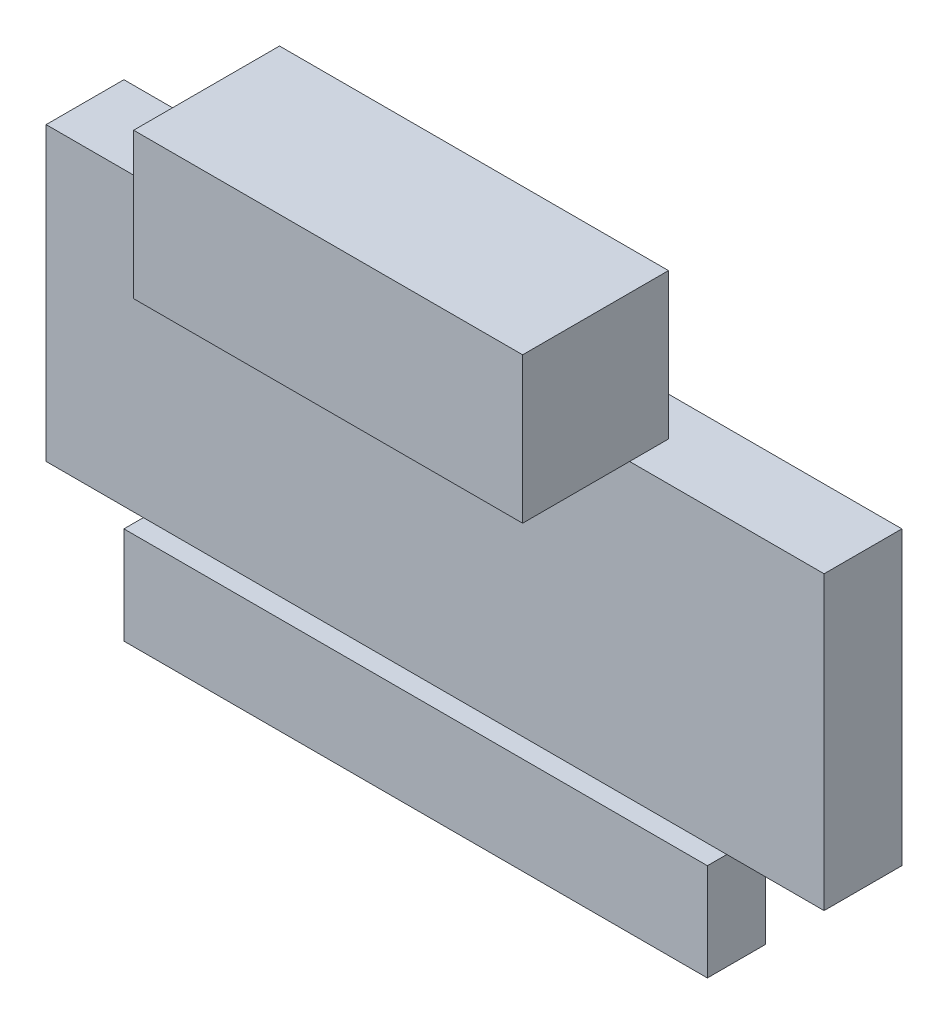
ISO-10303-21;
HEADER;
FILE_DESCRIPTION(('STEP AP214'),'2;1');
FILE_NAME('part.step','',(''),(''),'','','');
FILE_SCHEMA(('AUTOMOTIVE_DESIGN { 1 0 10303 214 1 1 1 1 }'));
ENDSEC;
DATA;
#1=APPLICATION_CONTEXT('core data for automotive mechanical design processes');
#2=APPLICATION_PROTOCOL_DEFINITION('international standard','automotive_design',2000,#1);
#3=PRODUCT_CONTEXT('',#1,'mechanical');
#4=PRODUCT('Part','Part','',(#3));
#5=PRODUCT_RELATED_PRODUCT_CATEGORY('part','',(#4));
#6=PRODUCT_DEFINITION_FORMATION('','',#4);
#7=PRODUCT_DEFINITION_CONTEXT('part definition',#1,'design');
#8=PRODUCT_DEFINITION('design','',#6,#7);
#9=PRODUCT_DEFINITION_SHAPE('','',#8);
#10=(LENGTH_UNIT() NAMED_UNIT(*) SI_UNIT(.MILLI.,.METRE.));
#11=(NAMED_UNIT(*) PLANE_ANGLE_UNIT() SI_UNIT($,.RADIAN.));
#12=(NAMED_UNIT(*) SI_UNIT($,.STERADIAN.) SOLID_ANGLE_UNIT());
#13=UNCERTAINTY_MEASURE_WITH_UNIT(LENGTH_MEASURE(1.E-05),#10,'distance_accuracy_value','');
#14=(GEOMETRIC_REPRESENTATION_CONTEXT(3) GLOBAL_UNCERTAINTY_ASSIGNED_CONTEXT((#13)) GLOBAL_UNIT_ASSIGNED_CONTEXT((#10,
#11,#12)) REPRESENTATION_CONTEXT('',''));
#15=CARTESIAN_POINT('',(0.,0.,0.));
#16=DIRECTION('',(0.,0.,1.));
#17=DIRECTION('',(1.,0.,0.));
#18=AXIS2_PLACEMENT_3D('',#15,#16,#17);
#19=CARTESIAN_POINT('',(20.,30.,4.));
#20=DIRECTION('',(0.,-1.,0.));
#21=DIRECTION('',(0.,0.,-1.));
#22=AXIS2_PLACEMENT_3D('',#19,#20,#21);
#23=PLANE('',#22);
#24=DIRECTION('',(-1.,0.,0.));
#25=VECTOR('',#24,1.);
#26=CARTESIAN_POINT('',(20.,30.,4.));
#27=LINE('',#26,#25);
#28=CARTESIAN_POINT('',(20.,30.,4.));
#29=VERTEX_POINT('',#28);
#30=CARTESIAN_POINT('',(-20.,30.,4.));
#31=VERTEX_POINT('',#30);
#32=EDGE_CURVE('E251',#29,#31,#27,.T.);
#33=ORIENTED_EDGE('',*,*,#32,.T.);
#34=DIRECTION('',(0.,0.,1.));
#35=VECTOR('',#34,1.);
#36=CARTESIAN_POINT('',(-20.,30.,4.));
#37=LINE('',#36,#35);
#38=CARTESIAN_POINT('',(-20.,30.,19.));
#39=VERTEX_POINT('',#38);
#40=EDGE_CURVE('E250',#31,#39,#37,.T.);
#41=ORIENTED_EDGE('',*,*,#40,.T.);
#42=DIRECTION('',(-1.,0.,0.));
#43=VECTOR('',#42,1.);
#44=CARTESIAN_POINT('',(20.,30.,19.));
#45=LINE('',#44,#43);
#46=CARTESIAN_POINT('',(20.,30.,19.));
#47=VERTEX_POINT('',#46);
#48=EDGE_CURVE('E10',#47,#39,#45,.T.);
#49=ORIENTED_EDGE('',*,*,#48,.F.);
#50=DIRECTION('',(0.,0.,1.));
#51=VECTOR('',#50,1.);
#52=CARTESIAN_POINT('',(20.,30.,4.));
#53=LINE('',#52,#51);
#54=EDGE_CURVE('E41',#29,#47,#53,.T.);
#55=ORIENTED_EDGE('',*,*,#54,.F.);
#56=EDGE_LOOP('',(#33,#41,#49,#55));
#57=FACE_BOUND('',#56,.T.);
#58=ADVANCED_FACE('F16',(#57),#23,.F.);
#59=CARTESIAN_POINT('',(0.,22.5,19.));
#60=DIRECTION('',(0.,0.,1.));
#61=DIRECTION('',(1.,0.,0.));
#62=AXIS2_PLACEMENT_3D('',#59,#60,#61);
#63=PLANE('',#62);
#64=DIRECTION('',(1.,0.,0.));
#65=VECTOR('',#64,1.);
#66=CARTESIAN_POINT('',(-20.,15.,19.));
#67=LINE('',#66,#65);
#68=CARTESIAN_POINT('',(-20.,15.,19.));
#69=VERTEX_POINT('',#68);
#70=CARTESIAN_POINT('',(20.,15.,19.));
#71=VERTEX_POINT('',#70);
#72=EDGE_CURVE('E157',#69,#71,#67,.T.);
#73=ORIENTED_EDGE('',*,*,#72,.T.);
#74=DIRECTION('',(0.,1.,0.));
#75=VECTOR('',#74,1.);
#76=CARTESIAN_POINT('',(20.,15.,19.));
#77=LINE('',#76,#75);
#78=EDGE_CURVE('E24',#71,#47,#77,.T.);
#79=ORIENTED_EDGE('',*,*,#78,.T.);
#80=ORIENTED_EDGE('',*,*,#48,.T.);
#81=DIRECTION('',(0.,-1.,0.));
#82=VECTOR('',#81,1.);
#83=CARTESIAN_POINT('',(-20.,30.,19.));
#84=LINE('',#83,#82);
#85=EDGE_CURVE('E245',#39,#69,#84,.T.);
#86=ORIENTED_EDGE('',*,*,#85,.T.);
#87=EDGE_LOOP('',(#73,#79,#80,#86));
#88=FACE_BOUND('',#87,.T.);
#89=ADVANCED_FACE('F259',(#88),#63,.T.);
#90=CARTESIAN_POINT('',(20.,15.,4.));
#91=DIRECTION('',(-1.,0.,0.));
#92=DIRECTION('',(0.,0.,1.));
#93=AXIS2_PLACEMENT_3D('',#90,#91,#92);
#94=PLANE('',#93);
#95=DIRECTION('',(0.,1.,0.));
#96=VECTOR('',#95,1.);
#97=CARTESIAN_POINT('',(20.,15.,4.));
#98=LINE('',#97,#96);
#99=CARTESIAN_POINT('',(20.,15.,4.));
#100=VERTEX_POINT('',#99);
#101=EDGE_CURVE('E254',#100,#29,#98,.T.);
#102=ORIENTED_EDGE('',*,*,#101,.T.);
#103=ORIENTED_EDGE('',*,*,#54,.T.);
#104=ORIENTED_EDGE('',*,*,#78,.F.);
#105=DIRECTION('',(0.,0.,1.));
#106=VECTOR('',#105,1.);
#107=CARTESIAN_POINT('',(20.,15.,4.));
#108=LINE('',#107,#106);
#109=CARTESIAN_POINT('',(20.,15.,8.));
#110=VERTEX_POINT('',#109);
#111=EDGE_CURVE('E242',#110,#71,#108,.T.);
#112=ORIENTED_EDGE('',*,*,#111,.F.);
#113=DIRECTION('',(0.,0.,1.));
#114=VECTOR('',#113,1.);
#115=CARTESIAN_POINT('',(20.,15.,4.));
#116=LINE('',#115,#114);
#117=EDGE_CURVE('E238',#100,#110,#116,.T.);
#118=ORIENTED_EDGE('',*,*,#117,.F.);
#119=EDGE_LOOP('',(#102,#103,#104,#112,#118));
#120=FACE_BOUND('',#119,.T.);
#121=ADVANCED_FACE('F261',(#120),#94,.F.);
#122=CARTESIAN_POINT('',(0.,22.5,4.));
#123=DIRECTION('',(0.,0.,1.));
#124=DIRECTION('',(1.,0.,0.));
#125=AXIS2_PLACEMENT_3D('',#122,#123,#124);
#126=PLANE('',#125);
#127=DIRECTION('',(0.,-1.,0.));
#128=VECTOR('',#127,1.);
#129=CARTESIAN_POINT('',(-20.,30.,4.));
#130=LINE('',#129,#128);
#131=CARTESIAN_POINT('',(-20.,15.,4.));
#132=VERTEX_POINT('',#131);
#133=EDGE_CURVE('E169',#31,#132,#130,.T.);
#134=ORIENTED_EDGE('',*,*,#133,.F.);
#135=ORIENTED_EDGE('',*,*,#32,.F.);
#136=ORIENTED_EDGE('',*,*,#101,.F.);
#137=DIRECTION('',(1.,0.,0.));
#138=VECTOR('',#137,1.);
#139=CARTESIAN_POINT('',(-20.,15.,4.));
#140=LINE('',#139,#138);
#141=EDGE_CURVE('E174',#132,#100,#140,.T.);
#142=ORIENTED_EDGE('',*,*,#141,.F.);
#143=EDGE_LOOP('',(#134,#135,#136,#142));
#144=FACE_BOUND('',#143,.T.);
#145=ADVANCED_FACE('F268',(#144),#126,.F.);
#146=CARTESIAN_POINT('',(-20.,30.,4.));
#147=DIRECTION('',(1.,0.,0.));
#148=DIRECTION('',(0.,1.,0.));
#149=AXIS2_PLACEMENT_3D('',#146,#147,#148);
#150=PLANE('',#149);
#151=ORIENTED_EDGE('',*,*,#133,.T.);
#152=DIRECTION('',(0.,0.,1.));
#153=VECTOR('',#152,1.);
#154=CARTESIAN_POINT('',(-20.,15.,4.));
#155=LINE('',#154,#153);
#156=CARTESIAN_POINT('',(-20.,15.,8.));
#157=VERTEX_POINT('',#156);
#158=EDGE_CURVE('E164',#132,#157,#155,.T.);
#159=ORIENTED_EDGE('',*,*,#158,.T.);
#160=DIRECTION('',(0.,0.,1.));
#161=VECTOR('',#160,1.);
#162=CARTESIAN_POINT('',(-20.,15.,4.));
#163=LINE('',#162,#161);
#164=EDGE_CURVE('E149',#157,#69,#163,.T.);
#165=ORIENTED_EDGE('',*,*,#164,.T.);
#166=ORIENTED_EDGE('',*,*,#85,.F.);
#167=ORIENTED_EDGE('',*,*,#40,.F.);
#168=EDGE_LOOP('',(#151,#159,#165,#166,#167));
#169=FACE_BOUND('',#168,.T.);
#170=ADVANCED_FACE('F166',(#169),#150,.F.);
#171=CARTESIAN_POINT('',(0.,-20.,10.));
#172=DIRECTION('',(0.,0.,1.));
#173=DIRECTION('',(1.,0.,0.));
#174=AXIS2_PLACEMENT_3D('',#171,#172,#173);
#175=PLANE('',#174);
#176=DIRECTION('',(1.,0.,0.));
#177=VECTOR('',#176,1.);
#178=CARTESIAN_POINT('',(-30.,-25.,10.));
#179=LINE('',#178,#177);
#180=CARTESIAN_POINT('',(-30.,-25.,10.));
#181=VERTEX_POINT('',#180);
#182=CARTESIAN_POINT('',(30.,-25.,10.));
#183=VERTEX_POINT('',#182);
#184=EDGE_CURVE('E161',#181,#183,#179,.T.);
#185=ORIENTED_EDGE('',*,*,#184,.T.);
#186=DIRECTION('',(0.,1.,0.));
#187=VECTOR('',#186,1.);
#188=CARTESIAN_POINT('',(30.,-25.,10.));
#189=LINE('',#188,#187);
#190=CARTESIAN_POINT('',(30.,-15.,10.));
#191=VERTEX_POINT('',#190);
#192=EDGE_CURVE('E207',#183,#191,#189,.T.);
#193=ORIENTED_EDGE('',*,*,#192,.T.);
#194=DIRECTION('',(-1.,0.,0.));
#195=VECTOR('',#194,1.);
#196=CARTESIAN_POINT('',(30.,-15.,10.));
#197=LINE('',#196,#195);
#198=CARTESIAN_POINT('',(-30.,-15.,10.));
#199=VERTEX_POINT('',#198);
#200=EDGE_CURVE('E239',#191,#199,#197,.T.);
#201=ORIENTED_EDGE('',*,*,#200,.T.);
#202=DIRECTION('',(0.,-1.,0.));
#203=VECTOR('',#202,1.);
#204=CARTESIAN_POINT('',(-30.,-15.,10.));
#205=LINE('',#204,#203);
#206=EDGE_CURVE('E226',#199,#181,#205,.T.);
#207=ORIENTED_EDGE('',*,*,#206,.T.);
#208=EDGE_LOOP('',(#185,#193,#201,#207));
#209=FACE_BOUND('',#208,.T.);
#210=ADVANCED_FACE('F364',(#209),#175,.T.);
#211=CARTESIAN_POINT('',(-30.,-25.,4.));
#212=DIRECTION('',(0.,1.,0.));
#213=DIRECTION('',(1.,0.,0.));
#214=AXIS2_PLACEMENT_3D('',#211,#212,#213);
#215=PLANE('',#214);
#216=DIRECTION('',(1.,0.,0.));
#217=VECTOR('',#216,1.);
#218=CARTESIAN_POINT('',(-30.,-25.,4.));
#219=LINE('',#218,#217);
#220=CARTESIAN_POINT('',(-30.,-25.,4.));
#221=VERTEX_POINT('',#220);
#222=CARTESIAN_POINT('',(30.,-25.,4.));
#223=VERTEX_POINT('',#222);
#224=EDGE_CURVE('E219',#221,#223,#219,.T.);
#225=ORIENTED_EDGE('',*,*,#224,.T.);
#226=DIRECTION('',(0.,0.,1.));
#227=VECTOR('',#226,1.);
#228=CARTESIAN_POINT('',(30.,-25.,4.));
#229=LINE('',#228,#227);
#230=EDGE_CURVE('E211',#223,#183,#229,.T.);
#231=ORIENTED_EDGE('',*,*,#230,.T.);
#232=ORIENTED_EDGE('',*,*,#184,.F.);
#233=DIRECTION('',(0.,0.,1.));
#234=VECTOR('',#233,1.);
#235=CARTESIAN_POINT('',(-30.,-25.,4.));
#236=LINE('',#235,#234);
#237=EDGE_CURVE('E222',#221,#181,#236,.T.);
#238=ORIENTED_EDGE('',*,*,#237,.F.);
#239=EDGE_LOOP('',(#225,#231,#232,#238));
#240=FACE_BOUND('',#239,.T.);
#241=ADVANCED_FACE('F362',(#240),#215,.F.);
#242=CARTESIAN_POINT('',(-20.,15.,4.));
#243=DIRECTION('',(0.,1.,0.));
#244=DIRECTION('',(1.,0.,0.));
#245=AXIS2_PLACEMENT_3D('',#242,#243,#244);
#246=PLANE('',#245);
#247=ORIENTED_EDGE('',*,*,#111,.T.);
#248=ORIENTED_EDGE('',*,*,#72,.F.);
#249=ORIENTED_EDGE('',*,*,#164,.F.);
#250=DIRECTION('',(-1.,0.,0.));
#251=VECTOR('',#250,1.);
#252=CARTESIAN_POINT('',(40.,15.,8.));
#253=LINE('',#252,#251);
#254=EDGE_CURVE('E154',#110,#157,#253,.T.);
#255=ORIENTED_EDGE('',*,*,#254,.F.);
#256=EDGE_LOOP('',(#247,#248,#249,#255));
#257=FACE_BOUND('',#256,.T.);
#258=ADVANCED_FACE('F152',(#257),#246,.F.);
#259=CARTESIAN_POINT('',(30.,-15.,4.));
#260=DIRECTION('',(0.,-1.,0.));
#261=DIRECTION('',(0.,0.,-1.));
#262=AXIS2_PLACEMENT_3D('',#259,#260,#261);
#263=PLANE('',#262);
#264=DIRECTION('',(0.,0.,1.));
#265=VECTOR('',#264,1.);
#266=CARTESIAN_POINT('',(-30.,-15.,4.));
#267=LINE('',#266,#265);
#268=CARTESIAN_POINT('',(-30.,-15.,8.));
#269=VERTEX_POINT('',#268);
#270=EDGE_CURVE('E230',#269,#199,#267,.T.);
#271=ORIENTED_EDGE('',*,*,#270,.T.);
#272=ORIENTED_EDGE('',*,*,#200,.F.);
#273=DIRECTION('',(0.,0.,1.));
#274=VECTOR('',#273,1.);
#275=CARTESIAN_POINT('',(30.,-15.,4.));
#276=LINE('',#275,#274);
#277=CARTESIAN_POINT('',(30.,-15.,8.));
#278=VERTEX_POINT('',#277);
#279=EDGE_CURVE('E203',#278,#191,#276,.T.);
#280=ORIENTED_EDGE('',*,*,#279,.F.);
#281=DIRECTION('',(1.,0.,0.));
#282=VECTOR('',#281,1.);
#283=CARTESIAN_POINT('',(-40.,-15.,8.));
#284=LINE('',#283,#282);
#285=EDGE_CURVE('E195',#269,#278,#284,.T.);
#286=ORIENTED_EDGE('',*,*,#285,.F.);
#287=EDGE_LOOP('',(#271,#272,#280,#286));
#288=FACE_BOUND('',#287,.T.);
#289=ADVANCED_FACE('F352',(#288),#263,.F.);
#290=CARTESIAN_POINT('',(40.,15.,0.));
#291=DIRECTION('',(0.,-1.,0.));
#292=DIRECTION('',(0.,0.,-1.));
#293=AXIS2_PLACEMENT_3D('',#290,#291,#292);
#294=PLANE('',#293);
#295=DIRECTION('',(0.,0.,1.));
#296=VECTOR('',#295,1.);
#297=CARTESIAN_POINT('',(-40.,15.,0.));
#298=LINE('',#297,#296);
#299=CARTESIAN_POINT('',(-40.,15.,0.));
#300=VERTEX_POINT('',#299);
#301=CARTESIAN_POINT('',(-40.,15.,8.));
#302=VERTEX_POINT('',#301);
#303=EDGE_CURVE('E175',#300,#302,#298,.T.);
#304=ORIENTED_EDGE('',*,*,#303,.T.);
#305=DIRECTION('',(-1.,0.,0.));
#306=VECTOR('',#305,1.);
#307=CARTESIAN_POINT('',(40.,15.,8.));
#308=LINE('',#307,#306);
#309=EDGE_CURVE('E178',#157,#302,#308,.T.);
#310=ORIENTED_EDGE('',*,*,#309,.F.);
#311=ORIENTED_EDGE('',*,*,#158,.F.);
#312=ORIENTED_EDGE('',*,*,#141,.T.);
#313=ORIENTED_EDGE('',*,*,#117,.T.);
#314=DIRECTION('',(-1.,0.,0.));
#315=VECTOR('',#314,1.);
#316=CARTESIAN_POINT('',(40.,15.,8.));
#317=LINE('',#316,#315);
#318=CARTESIAN_POINT('',(40.,15.,8.));
#319=VERTEX_POINT('',#318);
#320=EDGE_CURVE('E189',#319,#110,#317,.T.);
#321=ORIENTED_EDGE('',*,*,#320,.F.);
#322=DIRECTION('',(0.,0.,1.));
#323=VECTOR('',#322,1.);
#324=CARTESIAN_POINT('',(40.,15.,0.));
#325=LINE('',#324,#323);
#326=CARTESIAN_POINT('',(40.,15.,0.));
#327=VERTEX_POINT('',#326);
#328=EDGE_CURVE('E290',#327,#319,#325,.T.);
#329=ORIENTED_EDGE('',*,*,#328,.F.);
#330=DIRECTION('',(-1.,0.,0.));
#331=VECTOR('',#330,1.);
#332=CARTESIAN_POINT('',(40.,15.,0.));
#333=LINE('',#332,#331);
#334=EDGE_CURVE('E317',#327,#300,#333,.T.);
#335=ORIENTED_EDGE('',*,*,#334,.T.);
#336=EDGE_LOOP('',(#304,#310,#311,#312,#313,#321,#329,#335));
#337=FACE_BOUND('',#336,.T.);
#338=ADVANCED_FACE('F179',(#337),#294,.F.);
#339=CARTESIAN_POINT('',(-40.,15.,0.));
#340=DIRECTION('',(1.,0.,0.));
#341=DIRECTION('',(0.,1.,0.));
#342=AXIS2_PLACEMENT_3D('',#339,#340,#341);
#343=PLANE('',#342);
#344=DIRECTION('',(0.,-1.,0.));
#345=VECTOR('',#344,1.);
#346=CARTESIAN_POINT('',(-40.,15.,0.));
#347=LINE('',#346,#345);
#348=CARTESIAN_POINT('',(-40.,-15.,0.));
#349=VERTEX_POINT('',#348);
#350=EDGE_CURVE('E313',#300,#349,#347,.T.);
#351=ORIENTED_EDGE('',*,*,#350,.T.);
#352=DIRECTION('',(0.,0.,1.));
#353=VECTOR('',#352,1.);
#354=CARTESIAN_POINT('',(-40.,-15.,0.));
#355=LINE('',#354,#353);
#356=CARTESIAN_POINT('',(-40.,-15.,8.));
#357=VERTEX_POINT('',#356);
#358=EDGE_CURVE('E306',#349,#357,#355,.T.);
#359=ORIENTED_EDGE('',*,*,#358,.T.);
#360=DIRECTION('',(0.,-1.,0.));
#361=VECTOR('',#360,1.);
#362=CARTESIAN_POINT('',(-40.,15.,8.));
#363=LINE('',#362,#361);
#364=EDGE_CURVE('E184',#302,#357,#363,.T.);
#365=ORIENTED_EDGE('',*,*,#364,.F.);
#366=ORIENTED_EDGE('',*,*,#303,.F.);
#367=EDGE_LOOP('',(#351,#359,#365,#366));
#368=FACE_BOUND('',#367,.T.);
#369=ADVANCED_FACE('F340',(#368),#343,.F.);
#370=CARTESIAN_POINT('',(-30.,-15.,4.));
#371=DIRECTION('',(1.,0.,0.));
#372=DIRECTION('',(0.,1.,0.));
#373=AXIS2_PLACEMENT_3D('',#370,#371,#372);
#374=PLANE('',#373);
#375=DIRECTION('',(0.,-1.,0.));
#376=VECTOR('',#375,1.);
#377=CARTESIAN_POINT('',(-30.,-15.,4.));
#378=LINE('',#377,#376);
#379=CARTESIAN_POINT('',(-30.,-15.,4.));
#380=VERTEX_POINT('',#379);
#381=EDGE_CURVE('E215',#380,#221,#378,.T.);
#382=ORIENTED_EDGE('',*,*,#381,.T.);
#383=ORIENTED_EDGE('',*,*,#237,.T.);
#384=ORIENTED_EDGE('',*,*,#206,.F.);
#385=ORIENTED_EDGE('',*,*,#270,.F.);
#386=DIRECTION('',(0.,0.,1.));
#387=VECTOR('',#386,1.);
#388=CARTESIAN_POINT('',(-30.,-15.,4.));
#389=LINE('',#388,#387);
#390=EDGE_CURVE('E299',#380,#269,#389,.T.);
#391=ORIENTED_EDGE('',*,*,#390,.F.);
#392=EDGE_LOOP('',(#382,#383,#384,#385,#391));
#393=FACE_BOUND('',#392,.T.);
#394=ADVANCED_FACE('F349',(#393),#374,.F.);
#395=CARTESIAN_POINT('',(0.,-20.,4.));
#396=DIRECTION('',(0.,0.,1.));
#397=DIRECTION('',(1.,0.,0.));
#398=AXIS2_PLACEMENT_3D('',#395,#396,#397);
#399=PLANE('',#398);
#400=ORIENTED_EDGE('',*,*,#381,.F.);
#401=DIRECTION('',(-1.,0.,0.));
#402=VECTOR('',#401,1.);
#403=CARTESIAN_POINT('',(30.,-15.,4.));
#404=LINE('',#403,#402);
#405=CARTESIAN_POINT('',(30.,-15.,4.));
#406=VERTEX_POINT('',#405);
#407=EDGE_CURVE('E287',#406,#380,#404,.T.);
#408=ORIENTED_EDGE('',*,*,#407,.F.);
#409=DIRECTION('',(0.,1.,0.));
#410=VECTOR('',#409,1.);
#411=CARTESIAN_POINT('',(30.,-25.,4.));
#412=LINE('',#411,#410);
#413=EDGE_CURVE('E200',#223,#406,#412,.T.);
#414=ORIENTED_EDGE('',*,*,#413,.F.);
#415=ORIENTED_EDGE('',*,*,#224,.F.);
#416=EDGE_LOOP('',(#400,#408,#414,#415));
#417=FACE_BOUND('',#416,.T.);
#418=ADVANCED_FACE('F360',(#417),#399,.F.);
#419=CARTESIAN_POINT('',(30.,-25.,4.));
#420=DIRECTION('',(-1.,0.,0.));
#421=DIRECTION('',(0.,0.,1.));
#422=AXIS2_PLACEMENT_3D('',#419,#420,#421);
#423=PLANE('',#422);
#424=ORIENTED_EDGE('',*,*,#413,.T.);
#425=DIRECTION('',(0.,0.,1.));
#426=VECTOR('',#425,1.);
#427=CARTESIAN_POINT('',(30.,-15.,4.));
#428=LINE('',#427,#426);
#429=EDGE_CURVE('E283',#406,#278,#428,.T.);
#430=ORIENTED_EDGE('',*,*,#429,.T.);
#431=ORIENTED_EDGE('',*,*,#279,.T.);
#432=ORIENTED_EDGE('',*,*,#192,.F.);
#433=ORIENTED_EDGE('',*,*,#230,.F.);
#434=EDGE_LOOP('',(#424,#430,#431,#432,#433));
#435=FACE_BOUND('',#434,.T.);
#436=ADVANCED_FACE('F355',(#435),#423,.F.);
#437=CARTESIAN_POINT('',(0.,0.,8.));
#438=DIRECTION('',(0.,0.,1.));
#439=DIRECTION('',(1.,0.,0.));
#440=AXIS2_PLACEMENT_3D('',#437,#438,#439);
#441=PLANE('',#440);
#442=DIRECTION('',(1.,0.,0.));
#443=VECTOR('',#442,1.);
#444=CARTESIAN_POINT('',(-40.,-15.,8.));
#445=LINE('',#444,#443);
#446=EDGE_CURVE('E302',#357,#269,#445,.T.);
#447=ORIENTED_EDGE('',*,*,#446,.T.);
#448=ORIENTED_EDGE('',*,*,#285,.T.);
#449=DIRECTION('',(1.,0.,0.));
#450=VECTOR('',#449,1.);
#451=CARTESIAN_POINT('',(-40.,-15.,8.));
#452=LINE('',#451,#450);
#453=CARTESIAN_POINT('',(40.,-15.,8.));
#454=VERTEX_POINT('',#453);
#455=EDGE_CURVE('E279',#278,#454,#452,.T.);
#456=ORIENTED_EDGE('',*,*,#455,.T.);
#457=DIRECTION('',(0.,1.,0.));
#458=VECTOR('',#457,1.);
#459=CARTESIAN_POINT('',(40.,-15.,8.));
#460=LINE('',#459,#458);
#461=EDGE_CURVE('E294',#454,#319,#460,.T.);
#462=ORIENTED_EDGE('',*,*,#461,.T.);
#463=ORIENTED_EDGE('',*,*,#320,.T.);
#464=ORIENTED_EDGE('',*,*,#254,.T.);
#465=ORIENTED_EDGE('',*,*,#309,.T.);
#466=ORIENTED_EDGE('',*,*,#364,.T.);
#467=EDGE_LOOP('',(#447,#448,#456,#462,#463,#464,#465,#466));
#468=FACE_BOUND('',#467,.T.);
#469=ADVANCED_FACE('F187',(#468),#441,.T.);
#470=CARTESIAN_POINT('',(40.,-15.,0.));
#471=DIRECTION('',(-1.,0.,0.));
#472=DIRECTION('',(0.,0.,1.));
#473=AXIS2_PLACEMENT_3D('',#470,#471,#472);
#474=PLANE('',#473);
#475=DIRECTION('',(0.,1.,0.));
#476=VECTOR('',#475,1.);
#477=CARTESIAN_POINT('',(40.,-15.,0.));
#478=LINE('',#477,#476);
#479=CARTESIAN_POINT('',(40.,-15.,0.));
#480=VERTEX_POINT('',#479);
#481=EDGE_CURVE('E295',#480,#327,#478,.T.);
#482=ORIENTED_EDGE('',*,*,#481,.T.);
#483=ORIENTED_EDGE('',*,*,#328,.T.);
#484=ORIENTED_EDGE('',*,*,#461,.F.);
#485=DIRECTION('',(0.,0.,1.));
#486=VECTOR('',#485,1.);
#487=CARTESIAN_POINT('',(40.,-15.,0.));
#488=LINE('',#487,#486);
#489=EDGE_CURVE('E275',#480,#454,#488,.T.);
#490=ORIENTED_EDGE('',*,*,#489,.F.);
#491=EDGE_LOOP('',(#482,#483,#484,#490));
#492=FACE_BOUND('',#491,.T.);
#493=ADVANCED_FACE('F332',(#492),#474,.F.);
#494=CARTESIAN_POINT('',(0.,0.,0.));
#495=DIRECTION('',(0.,0.,1.));
#496=DIRECTION('',(1.,0.,0.));
#497=AXIS2_PLACEMENT_3D('',#494,#495,#496);
#498=PLANE('',#497);
#499=ORIENTED_EDGE('',*,*,#350,.F.);
#500=ORIENTED_EDGE('',*,*,#334,.F.);
#501=ORIENTED_EDGE('',*,*,#481,.F.);
#502=DIRECTION('',(1.,0.,0.));
#503=VECTOR('',#502,1.);
#504=CARTESIAN_POINT('',(-40.,-15.,0.));
#505=LINE('',#504,#503);
#506=EDGE_CURVE('E310',#349,#480,#505,.T.);
#507=ORIENTED_EDGE('',*,*,#506,.F.);
#508=EDGE_LOOP('',(#499,#500,#501,#507));
#509=FACE_BOUND('',#508,.T.);
#510=ADVANCED_FACE('F337',(#509),#498,.F.);
#511=CARTESIAN_POINT('',(-40.,-15.,0.));
#512=DIRECTION('',(0.,1.,0.));
#513=DIRECTION('',(1.,0.,0.));
#514=AXIS2_PLACEMENT_3D('',#511,#512,#513);
#515=PLANE('',#514);
#516=ORIENTED_EDGE('',*,*,#489,.T.);
#517=ORIENTED_EDGE('',*,*,#455,.F.);
#518=ORIENTED_EDGE('',*,*,#429,.F.);
#519=ORIENTED_EDGE('',*,*,#407,.T.);
#520=ORIENTED_EDGE('',*,*,#390,.T.);
#521=ORIENTED_EDGE('',*,*,#446,.F.);
#522=ORIENTED_EDGE('',*,*,#358,.F.);
#523=ORIENTED_EDGE('',*,*,#506,.T.);
#524=EDGE_LOOP('',(#516,#517,#518,#519,#520,#521,#522,#523));
#525=FACE_BOUND('',#524,.T.);
#526=ADVANCED_FACE('F345',(#525),#515,.F.);
#527=CLOSED_SHELL('',(#58,#89,#121,#145,#170,#210,#241,#258,#289,#338,#369,#394,#418,#436,#469,
#493,#510,#526));
#528=MANIFOLD_SOLID_BREP('B1',#527);
#529=ADVANCED_BREP_SHAPE_REPRESENTATION('',(#18,#528),#14);
#530=SHAPE_DEFINITION_REPRESENTATION(#9,#529);
ENDSEC;
END-ISO-10303-21;
